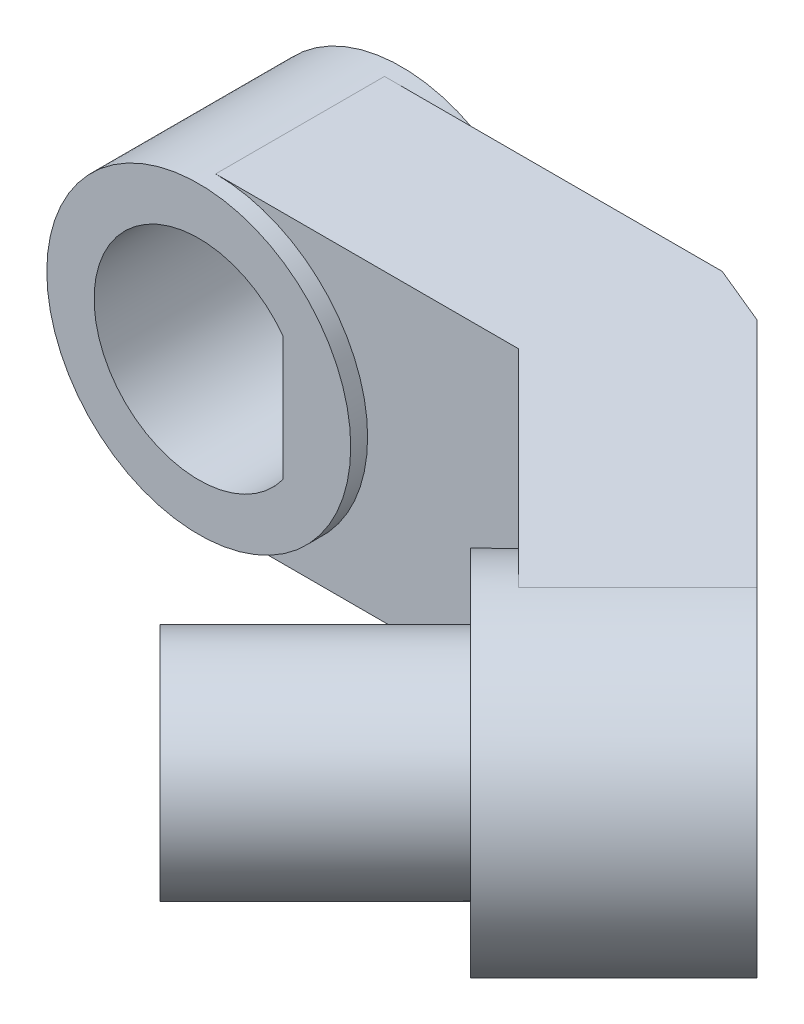
ISO-10303-21;
HEADER;
FILE_DESCRIPTION(('STEP AP214'),'2;1');
FILE_NAME('part.step','',(''),(''),'','','');
FILE_SCHEMA(('AUTOMOTIVE_DESIGN { 1 0 10303 214 1 1 1 1 }'));
ENDSEC;
DATA;
#1=APPLICATION_CONTEXT('core data for automotive mechanical design processes');
#2=APPLICATION_PROTOCOL_DEFINITION('international standard','automotive_design',2000,#1);
#3=PRODUCT_CONTEXT('',#1,'mechanical');
#4=PRODUCT('Part','Part','',(#3));
#5=PRODUCT_RELATED_PRODUCT_CATEGORY('part','',(#4));
#6=PRODUCT_DEFINITION_FORMATION('','',#4);
#7=PRODUCT_DEFINITION_CONTEXT('part definition',#1,'design');
#8=PRODUCT_DEFINITION('design','',#6,#7);
#9=PRODUCT_DEFINITION_SHAPE('','',#8);
#10=(LENGTH_UNIT() NAMED_UNIT(*) SI_UNIT(.MILLI.,.METRE.));
#11=(NAMED_UNIT(*) PLANE_ANGLE_UNIT() SI_UNIT($,.RADIAN.));
#12=(NAMED_UNIT(*) SI_UNIT($,.STERADIAN.) SOLID_ANGLE_UNIT());
#13=UNCERTAINTY_MEASURE_WITH_UNIT(LENGTH_MEASURE(1.E-05),#10,'distance_accuracy_value','');
#14=(GEOMETRIC_REPRESENTATION_CONTEXT(3) GLOBAL_UNCERTAINTY_ASSIGNED_CONTEXT((#13)) GLOBAL_UNIT_ASSIGNED_CONTEXT((#10,
#11,#12)) REPRESENTATION_CONTEXT('',''));
#15=CARTESIAN_POINT('',(0.,0.,0.));
#16=DIRECTION('',(0.,0.,1.));
#17=DIRECTION('',(1.,0.,0.));
#18=AXIS2_PLACEMENT_3D('',#15,#16,#17);
#19=CARTESIAN_POINT('',(0.,0.,2.5));
#20=DIRECTION('',(0.,0.,1.));
#21=DIRECTION('',(1.,0.,0.));
#22=AXIS2_PLACEMENT_3D('',#19,#20,#21);
#23=PLANE('',#22);
#24=DIRECTION('',(1.,0.,0.));
#25=VECTOR('',#24,1.);
#26=CARTESIAN_POINT('',(-1.11022302462516E-13,-4.49999999999995,2.49999999999989));
#27=LINE('',#26,#25);
#28=CARTESIAN_POINT('',(0.,-4.49999999999997,2.50000000000089));
#29=VERTEX_POINT('',#28);
#30=CARTESIAN_POINT('',(8.96446609406728,-4.5,2.5));
#31=VERTEX_POINT('',#30);
#32=EDGE_CURVE('E136',#29,#31,#27,.T.);
#33=ORIENTED_EDGE('',*,*,#32,.T.);
#34=DIRECTION('',(0.,1.,0.));
#35=VECTOR('',#34,1.);
#36=CARTESIAN_POINT('',(8.96446609406727,0.,2.5));
#37=LINE('',#36,#35);
#38=CARTESIAN_POINT('',(8.9644660940673,4.50000000000011,2.50000000000015));
#39=VERTEX_POINT('',#38);
#40=EDGE_CURVE('E63',#31,#39,#37,.T.);
#41=ORIENTED_EDGE('',*,*,#40,.T.);
#42=DIRECTION('',(1.,0.,0.));
#43=VECTOR('',#42,1.);
#44=CARTESIAN_POINT('',(0.,4.50000000000012,2.50000000000011));
#45=LINE('',#44,#43);
#46=CARTESIAN_POINT('',(0.,4.50000000000006,2.50000000000011));
#47=VERTEX_POINT('',#46);
#48=EDGE_CURVE('E144',#47,#39,#45,.T.);
#49=ORIENTED_EDGE('',*,*,#48,.F.);
#50=CARTESIAN_POINT('',(0.,0.,2.5));
#51=DIRECTION('',(0.,0.,1.));
#52=DIRECTION('',(1.,0.,0.));
#53=AXIS2_PLACEMENT_3D('',#50,#51,#52);
#54=CIRCLE('',#53,4.5);
#55=EDGE_CURVE('E124',#29,#47,#54,.T.);
#56=ORIENTED_EDGE('',*,*,#55,.F.);
#57=EDGE_LOOP('',(#33,#41,#49,#56));
#58=FACE_BOUND('',#57,.T.);
#59=ADVANCED_FACE('F53',(#58),#23,.T.);
#60=CARTESIAN_POINT('',(0.,0.,3.));
#61=DIRECTION('',(0.,0.,1.));
#62=DIRECTION('',(1.,0.,0.));
#63=AXIS2_PLACEMENT_3D('',#60,#61,#62);
#64=PLANE('',#63);
#65=CARTESIAN_POINT('',(0.,0.,3.));
#66=DIRECTION('',(0.,0.,1.));
#67=DIRECTION('',(1.,0.,0.));
#68=AXIS2_PLACEMENT_3D('',#65,#66,#67);
#69=CIRCLE('',#68,4.5);
#70=CARTESIAN_POINT('',(4.5,0.,3.));
#71=VERTEX_POINT('',#70);
#72=EDGE_CURVE('E185',#71,#71,#69,.T.);
#73=ORIENTED_EDGE('',*,*,#72,.T.);
#74=EDGE_LOOP('',(#73));
#75=FACE_BOUND('',#74,.T.);
#76=DIRECTION('',(0.,1.,0.));
#77=VECTOR('',#76,1.);
#78=CARTESIAN_POINT('',(2.5,-1.83303027798234,3.));
#79=LINE('',#78,#77);
#80=CARTESIAN_POINT('',(2.5,-1.83303027798234,3.));
#81=VERTEX_POINT('',#80);
#82=CARTESIAN_POINT('',(2.5,1.83303027798234,3.));
#83=VERTEX_POINT('',#82);
#84=EDGE_CURVE('E166',#81,#83,#79,.T.);
#85=ORIENTED_EDGE('',*,*,#84,.F.);
#86=CARTESIAN_POINT('',(0.,0.,3.));
#87=DIRECTION('',(0.,0.,1.));
#88=DIRECTION('',(1.,0.,0.));
#89=AXIS2_PLACEMENT_3D('',#86,#87,#88);
#90=CIRCLE('',#89,3.1);
#91=EDGE_CURVE('E162',#83,#81,#90,.T.);
#92=ORIENTED_EDGE('',*,*,#91,.F.);
#93=EDGE_LOOP('',(#85,#92));
#94=FACE_BOUND('',#93,.T.);
#95=ADVANCED_FACE('F275',(#75,#94),#64,.T.);
#96=CARTESIAN_POINT('',(0.,0.,-3.));
#97=DIRECTION('',(0.,0.,1.));
#98=DIRECTION('',(1.,0.,0.));
#99=AXIS2_PLACEMENT_3D('',#96,#97,#98);
#100=PLANE('',#99);
#101=CARTESIAN_POINT('',(0.,0.,-3.));
#102=DIRECTION('',(0.,0.,1.));
#103=DIRECTION('',(1.,0.,0.));
#104=AXIS2_PLACEMENT_3D('',#101,#102,#103);
#105=CIRCLE('',#104,4.5);
#106=CARTESIAN_POINT('',(4.5,0.,-3.));
#107=VERTEX_POINT('',#106);
#108=EDGE_CURVE('E184',#107,#107,#105,.T.);
#109=ORIENTED_EDGE('',*,*,#108,.F.);
#110=EDGE_LOOP('',(#109));
#111=FACE_BOUND('',#110,.T.);
#112=CARTESIAN_POINT('',(0.,0.,-3.));
#113=DIRECTION('',(0.,0.,1.));
#114=DIRECTION('',(1.,0.,0.));
#115=AXIS2_PLACEMENT_3D('',#112,#113,#114);
#116=CIRCLE('',#115,3.1);
#117=CARTESIAN_POINT('',(2.5,1.83303027798234,-3.));
#118=VERTEX_POINT('',#117);
#119=CARTESIAN_POINT('',(2.5,-1.83303027798234,-3.));
#120=VERTEX_POINT('',#119);
#121=EDGE_CURVE('E161',#118,#120,#116,.T.);
#122=ORIENTED_EDGE('',*,*,#121,.T.);
#123=DIRECTION('',(0.,1.,0.));
#124=VECTOR('',#123,1.);
#125=CARTESIAN_POINT('',(2.5,-1.83303027798234,-3.));
#126=LINE('',#125,#124);
#127=EDGE_CURVE('E167',#120,#118,#126,.T.);
#128=ORIENTED_EDGE('',*,*,#127,.T.);
#129=EDGE_LOOP('',(#122,#128));
#130=FACE_BOUND('',#129,.T.);
#131=ADVANCED_FACE('F281',(#111,#130),#100,.F.);
#132=CARTESIAN_POINT('',(0.,0.,3.));
#133=DIRECTION('',(0.,0.,-1.));
#134=DIRECTION('',(-1.,0.,0.));
#135=AXIS2_PLACEMENT_3D('',#132,#133,#134);
#136=CYLINDRICAL_SURFACE('',#135,4.5);
#137=DIRECTION('',(0.,0.,-1.));
#138=VECTOR('',#137,1.);
#139=CARTESIAN_POINT('',(-1.11022302462516E-13,-4.49999999999995,2.49999999999989));
#140=LINE('',#139,#138);
#141=CARTESIAN_POINT('',(0.,-4.5,-2.50000000000001));
#142=VERTEX_POINT('',#141);
#143=EDGE_CURVE('E130',#29,#142,#140,.T.);
#144=ORIENTED_EDGE('',*,*,#143,.F.);
#145=ORIENTED_EDGE('',*,*,#55,.T.);
#146=DIRECTION('',(0.,0.,-1.));
#147=VECTOR('',#146,1.);
#148=CARTESIAN_POINT('',(0.,4.50000000000012,2.50000000000011));
#149=LINE('',#148,#147);
#150=CARTESIAN_POINT('',(0.,4.50000000000012,-2.49999999999989));
#151=VERTEX_POINT('',#150);
#152=EDGE_CURVE('E127',#47,#151,#149,.T.);
#153=ORIENTED_EDGE('',*,*,#152,.T.);
#154=CARTESIAN_POINT('',(0.,0.,-2.5));
#155=DIRECTION('',(0.,0.,1.));
#156=DIRECTION('',(1.,0.,0.));
#157=AXIS2_PLACEMENT_3D('',#154,#155,#156);
#158=CIRCLE('',#157,4.5);
#159=EDGE_CURVE('E154',#142,#151,#158,.T.);
#160=ORIENTED_EDGE('',*,*,#159,.F.);
#161=EDGE_LOOP('',(#144,#145,#153,#160));
#162=FACE_BOUND('',#161,.T.);
#163=ORIENTED_EDGE('',*,*,#72,.F.);
#164=EDGE_LOOP('',(#163));
#165=FACE_BOUND('',#164,.T.);
#166=ORIENTED_EDGE('',*,*,#108,.T.);
#167=EDGE_LOOP('',(#166));
#168=FACE_BOUND('',#167,.T.);
#169=ADVANCED_FACE('F55',(#162,#165,#168),#136,.T.);
#170=CARTESIAN_POINT('',(0.,0.,3.));
#171=DIRECTION('',(0.,0.,-1.));
#172=DIRECTION('',(-1.,0.,0.));
#173=AXIS2_PLACEMENT_3D('',#170,#171,#172);
#174=CYLINDRICAL_SURFACE('',#173,3.1);
#175=ORIENTED_EDGE('',*,*,#121,.F.);
#176=DIRECTION('',(0.,0.,-1.));
#177=VECTOR('',#176,1.);
#178=CARTESIAN_POINT('',(2.5,1.83303027798234,3.));
#179=LINE('',#178,#177);
#180=EDGE_CURVE('E170',#83,#118,#179,.T.);
#181=ORIENTED_EDGE('',*,*,#180,.F.);
#182=ORIENTED_EDGE('',*,*,#91,.T.);
#183=DIRECTION('',(0.,0.,-1.));
#184=VECTOR('',#183,1.);
#185=CARTESIAN_POINT('',(2.5,-1.83303027798234,3.));
#186=LINE('',#185,#184);
#187=EDGE_CURVE('E180',#81,#120,#186,.T.);
#188=ORIENTED_EDGE('',*,*,#187,.T.);
#189=EDGE_LOOP('',(#175,#181,#182,#188));
#190=FACE_BOUND('',#189,.T.);
#191=ADVANCED_FACE('F290',(#190),#174,.F.);
#192=CARTESIAN_POINT('',(2.5,-1.83303027798234,3.));
#193=DIRECTION('',(-1.,0.,0.));
#194=DIRECTION('',(0.,0.,1.));
#195=AXIS2_PLACEMENT_3D('',#192,#193,#194);
#196=PLANE('',#195);
#197=ORIENTED_EDGE('',*,*,#127,.F.);
#198=ORIENTED_EDGE('',*,*,#187,.F.);
#199=ORIENTED_EDGE('',*,*,#84,.T.);
#200=ORIENTED_EDGE('',*,*,#180,.T.);
#201=EDGE_LOOP('',(#197,#198,#199,#200));
#202=FACE_BOUND('',#201,.T.);
#203=ADVANCED_FACE('F287',(#202),#196,.T.);
#204=CARTESIAN_POINT('',(-1.11022302462516E-13,-4.49999999999995,2.49999999999989));
#205=DIRECTION('',(0.,1.,0.));
#206=DIRECTION('',(-1.,0.,0.));
#207=AXIS2_PLACEMENT_3D('',#204,#205,#206);
#208=PLANE('',#207);
#209=DIRECTION('',(1.,0.,0.));
#210=VECTOR('',#209,1.);
#211=CARTESIAN_POINT('',(-1.11022302462516E-13,-4.49999999999995,-2.50000000000011));
#212=LINE('',#211,#210);
#213=CARTESIAN_POINT('',(9.99999999999681,-4.49999999999998,-2.5));
#214=VERTEX_POINT('',#213);
#215=EDGE_CURVE('E156',#142,#214,#212,.T.);
#216=ORIENTED_EDGE('',*,*,#215,.T.);
#217=DIRECTION('',(-0.923879532511773,0.,-0.382683432363916));
#218=VECTOR('',#217,1.);
#219=CARTESIAN_POINT('',(11.7677669529664,-4.5,-1.76776695296638));
#220=LINE('',#219,#218);
#221=CARTESIAN_POINT('',(11.7677669529664,-4.5,-1.76776695296638));
#222=VERTEX_POINT('',#221);
#223=EDGE_CURVE('E90',#222,#214,#220,.T.);
#224=ORIENTED_EDGE('',*,*,#223,.F.);
#225=DIRECTION('',(0.707106781186551,0.,0.707106781186544));
#226=VECTOR('',#225,1.);
#227=CARTESIAN_POINT('',(6.76776695296631,-4.5,-6.76776695296638));
#228=LINE('',#227,#226);
#229=CARTESIAN_POINT('',(18.6267027304759,-4.5,5.09116882454309));
#230=VERTEX_POINT('',#229);
#231=EDGE_CURVE('E203',#222,#230,#228,.T.);
#232=ORIENTED_EDGE('',*,*,#231,.T.);
#233=DIRECTION('',(-0.707106781186544,0.,0.707106781186551));
#234=VECTOR('',#233,1.);
#235=CARTESIAN_POINT('',(18.6267027304759,-4.5,5.09116882454309));
#236=LINE('',#235,#234);
#237=CARTESIAN_POINT('',(15.0911688245432,-4.5,8.62670273047585));
#238=VERTEX_POINT('',#237);
#239=EDGE_CURVE('E212',#230,#238,#236,.T.);
#240=ORIENTED_EDGE('',*,*,#239,.T.);
#241=DIRECTION('',(0.707106781186551,0.,0.707106781186544));
#242=VECTOR('',#241,1.);
#243=CARTESIAN_POINT('',(3.23223304703359,-4.5,-3.23223304703363));
#244=LINE('',#243,#242);
#245=EDGE_CURVE('E202',#31,#238,#244,.T.);
#246=ORIENTED_EDGE('',*,*,#245,.F.);
#247=ORIENTED_EDGE('',*,*,#32,.F.);
#248=ORIENTED_EDGE('',*,*,#143,.T.);
#249=EDGE_LOOP('',(#216,#224,#232,#240,#246,#247,#248));
#250=FACE_BOUND('',#249,.T.);
#251=ADVANCED_FACE('F221',(#250),#208,.F.);
#252=CARTESIAN_POINT('',(0.,4.50000000000012,2.50000000000011));
#253=DIRECTION('',(0.,1.,0.));
#254=DIRECTION('',(-1.,0.,0.));
#255=AXIS2_PLACEMENT_3D('',#252,#253,#254);
#256=PLANE('',#255);
#257=DIRECTION('',(0.707106781186551,0.,0.707106781186544));
#258=VECTOR('',#257,1.);
#259=CARTESIAN_POINT('',(6.76776695296631,4.5,-6.76776695296638));
#260=LINE('',#259,#258);
#261=CARTESIAN_POINT('',(11.7677669529664,4.5,-1.76776695296638));
#262=VERTEX_POINT('',#261);
#263=CARTESIAN_POINT('',(18.6267027304759,4.5,5.09116882454309));
#264=VERTEX_POINT('',#263);
#265=EDGE_CURVE('E197',#262,#264,#260,.T.);
#266=ORIENTED_EDGE('',*,*,#265,.F.);
#267=DIRECTION('',(-0.923879532511761,0.,-0.382683432363945));
#268=VECTOR('',#267,1.);
#269=CARTESIAN_POINT('',(10.8838834764822,4.5,-2.1338834764823));
#270=LINE('',#269,#268);
#271=CARTESIAN_POINT('',(9.99999999999717,4.50000000000008,-2.49999999999984));
#272=VERTEX_POINT('',#271);
#273=EDGE_CURVE('E216',#262,#272,#270,.T.);
#274=ORIENTED_EDGE('',*,*,#273,.T.);
#275=DIRECTION('',(1.,0.,0.));
#276=VECTOR('',#275,1.);
#277=CARTESIAN_POINT('',(0.,4.50000000000012,-2.49999999999989));
#278=LINE('',#277,#276);
#279=EDGE_CURVE('E137',#151,#272,#278,.T.);
#280=ORIENTED_EDGE('',*,*,#279,.F.);
#281=ORIENTED_EDGE('',*,*,#152,.F.);
#282=ORIENTED_EDGE('',*,*,#48,.T.);
#283=DIRECTION('',(0.707106781186551,0.,0.707106781186544));
#284=VECTOR('',#283,1.);
#285=CARTESIAN_POINT('',(3.23223304703359,4.5,-3.23223304703363));
#286=LINE('',#285,#284);
#287=CARTESIAN_POINT('',(15.0911688245432,4.5,8.62670273047585));
#288=VERTEX_POINT('',#287);
#289=EDGE_CURVE('E71',#39,#288,#286,.T.);
#290=ORIENTED_EDGE('',*,*,#289,.T.);
#291=DIRECTION('',(-0.707106781186544,0.,0.707106781186551));
#292=VECTOR('',#291,1.);
#293=CARTESIAN_POINT('',(18.6267027304759,4.5,5.09116882454309));
#294=LINE('',#293,#292);
#295=EDGE_CURVE('E157',#264,#288,#294,.T.);
#296=ORIENTED_EDGE('',*,*,#295,.F.);
#297=EDGE_LOOP('',(#266,#274,#280,#281,#282,#290,#296));
#298=FACE_BOUND('',#297,.T.);
#299=ADVANCED_FACE('F143',(#298),#256,.T.);
#300=CARTESIAN_POINT('',(0.,0.,-2.5));
#301=DIRECTION('',(0.,0.,1.));
#302=DIRECTION('',(1.,0.,0.));
#303=AXIS2_PLACEMENT_3D('',#300,#301,#302);
#304=PLANE('',#303);
#305=ORIENTED_EDGE('',*,*,#159,.T.);
#306=ORIENTED_EDGE('',*,*,#279,.T.);
#307=DIRECTION('',(0.,1.,0.));
#308=VECTOR('',#307,1.);
#309=CARTESIAN_POINT('',(9.99999999999992,0.,-2.49999999999988));
#310=LINE('',#309,#308);
#311=EDGE_CURVE('E196',#214,#272,#310,.T.);
#312=ORIENTED_EDGE('',*,*,#311,.F.);
#313=ORIENTED_EDGE('',*,*,#215,.F.);
#314=EDGE_LOOP('',(#305,#306,#312,#313));
#315=FACE_BOUND('',#314,.T.);
#316=ADVANCED_FACE('F219',(#315),#304,.F.);
#317=CARTESIAN_POINT('',(18.6267027304759,0.,5.09116882454309));
#318=DIRECTION('',(-0.707106781186544,0.,0.707106781186551));
#319=DIRECTION('',(0.707106781186551,0.,0.707106781186544));
#320=AXIS2_PLACEMENT_3D('',#317,#318,#319);
#321=CYLINDRICAL_SURFACE('',#320,4.5);
#322=ORIENTED_EDGE('',*,*,#295,.T.);
#323=CARTESIAN_POINT('',(15.0911688245432,0.,8.62670273047585));
#324=DIRECTION('',(-0.707106781186544,0.,0.707106781186551));
#325=DIRECTION('',(0.707106781186551,0.,0.707106781186544));
#326=AXIS2_PLACEMENT_3D('',#323,#324,#325);
#327=CIRCLE('',#326,4.5);
#328=EDGE_CURVE('E96',#288,#238,#327,.T.);
#329=ORIENTED_EDGE('',*,*,#328,.T.);
#330=ORIENTED_EDGE('',*,*,#239,.F.);
#331=CARTESIAN_POINT('',(18.6267027304759,0.,5.09116882454309));
#332=DIRECTION('',(0.707106781186544,0.,-0.707106781186551));
#333=DIRECTION('',(-0.707106781186551,0.,-0.707106781186544));
#334=AXIS2_PLACEMENT_3D('',#331,#332,#333);
#335=CIRCLE('',#334,4.5);
#336=EDGE_CURVE('E201',#264,#230,#335,.T.);
#337=ORIENTED_EDGE('',*,*,#336,.F.);
#338=EDGE_LOOP('',(#322,#329,#330,#337));
#339=FACE_BOUND('',#338,.T.);
#340=CARTESIAN_POINT('',(14.3840620433566,0.,9.3338095116624));
#341=DIRECTION('',(-0.707106781186544,0.,0.707106781186551));
#342=DIRECTION('',(0.707106781186551,0.,0.707106781186544));
#343=AXIS2_PLACEMENT_3D('',#340,#341,#342);
#344=CIRCLE('',#343,4.5);
#345=CARTESIAN_POINT('',(17.5660425586961,0.,12.5157900270018));
#346=VERTEX_POINT('',#345);
#347=EDGE_CURVE('E253',#346,#346,#344,.T.);
#348=ORIENTED_EDGE('',*,*,#347,.F.);
#349=EDGE_LOOP('',(#348));
#350=FACE_BOUND('',#349,.T.);
#351=ADVANCED_FACE('F237',(#339,#350),#321,.T.);
#352=CARTESIAN_POINT('',(6.76776695296631,0.,-6.76776695296638));
#353=DIRECTION('',(0.707106781186544,0.,-0.707106781186551));
#354=DIRECTION('',(-0.707106781186551,0.,-0.707106781186544));
#355=AXIS2_PLACEMENT_3D('',#352,#353,#354);
#356=PLANE('',#355);
#357=ORIENTED_EDGE('',*,*,#265,.T.);
#358=ORIENTED_EDGE('',*,*,#336,.T.);
#359=ORIENTED_EDGE('',*,*,#231,.F.);
#360=DIRECTION('',(0.,1.,0.));
#361=VECTOR('',#360,1.);
#362=CARTESIAN_POINT('',(11.7677669529664,0.,-1.76776695296638));
#363=LINE('',#362,#361);
#364=EDGE_CURVE('E207',#222,#262,#363,.T.);
#365=ORIENTED_EDGE('',*,*,#364,.T.);
#366=EDGE_LOOP('',(#357,#358,#359,#365));
#367=FACE_BOUND('',#366,.T.);
#368=ADVANCED_FACE('F241',(#367),#356,.T.);
#369=CARTESIAN_POINT('',(3.23223304703359,0.,-3.23223304703363));
#370=DIRECTION('',(0.707106781186544,0.,-0.707106781186551));
#371=DIRECTION('',(-0.707106781186551,0.,-0.707106781186544));
#372=AXIS2_PLACEMENT_3D('',#369,#370,#371);
#373=PLANE('',#372);
#374=ORIENTED_EDGE('',*,*,#328,.F.);
#375=ORIENTED_EDGE('',*,*,#289,.F.);
#376=ORIENTED_EDGE('',*,*,#40,.F.);
#377=ORIENTED_EDGE('',*,*,#245,.T.);
#378=EDGE_LOOP('',(#374,#375,#376,#377));
#379=FACE_BOUND('',#378,.T.);
#380=ADVANCED_FACE('F268',(#379),#373,.F.);
#381=CARTESIAN_POINT('',(2.34834957053917,0.,-5.66941738240906));
#382=DIRECTION('',(0.382683432363916,0.,-0.923879532511773));
#383=DIRECTION('',(-0.923879532511773,0.,-0.382683432363916));
#384=AXIS2_PLACEMENT_3D('',#381,#382,#383);
#385=PLANE('',#384);
#386=ORIENTED_EDGE('',*,*,#223,.T.);
#387=ORIENTED_EDGE('',*,*,#311,.T.);
#388=ORIENTED_EDGE('',*,*,#273,.F.);
#389=ORIENTED_EDGE('',*,*,#364,.F.);
#390=EDGE_LOOP('',(#386,#387,#388,#389));
#391=FACE_BOUND('',#390,.T.);
#392=ADVANCED_FACE('F215',(#391),#385,.T.);
#393=CARTESIAN_POINT('',(14.3840620433566,0.,9.3338095116624));
#394=DIRECTION('',(-0.707106781186544,0.,0.707106781186551));
#395=DIRECTION('',(0.707106781186551,0.,0.707106781186544));
#396=AXIS2_PLACEMENT_3D('',#393,#394,#395);
#397=PLANE('',#396);
#398=CARTESIAN_POINT('',(14.3840620433566,0.,9.3338095116624));
#399=DIRECTION('',(-0.707106781186544,0.,0.707106781186551));
#400=DIRECTION('',(0.707106781186551,0.,0.707106781186544));
#401=AXIS2_PLACEMENT_3D('',#398,#399,#400);
#402=CIRCLE('',#401,2.9);
#403=CARTESIAN_POINT('',(16.4346717087976,0.,11.3844191771034));
#404=VERTEX_POINT('',#403);
#405=EDGE_CURVE('E12',#404,#404,#402,.F.);
#406=ORIENTED_EDGE('',*,*,#405,.T.);
#407=EDGE_LOOP('',(#406));
#408=FACE_BOUND('',#407,.T.);
#409=ORIENTED_EDGE('',*,*,#347,.T.);
#410=EDGE_LOOP('',(#409));
#411=FACE_BOUND('',#410,.T.);
#412=ADVANCED_FACE('F260',(#408,#411),#397,.T.);
#413=CARTESIAN_POINT('',(9.78786796564411,0.,13.930003589375));
#414=DIRECTION('',(0.707106781186544,0.,-0.707106781186551));
#415=DIRECTION('',(-0.707106781186551,0.,-0.707106781186544));
#416=AXIS2_PLACEMENT_3D('',#413,#414,#415);
#417=PLANE('',#416);
#418=CARTESIAN_POINT('',(9.78786796564411,0.,13.930003589375));
#419=DIRECTION('',(0.707106781186544,0.,-0.707106781186551));
#420=DIRECTION('',(-0.707106781186551,0.,-0.707106781186544));
#421=AXIS2_PLACEMENT_3D('',#418,#419,#420);
#422=CIRCLE('',#421,2.9);
#423=CARTESIAN_POINT('',(7.73725830020311,0.,11.879393923934));
#424=VERTEX_POINT('',#423);
#425=EDGE_CURVE('E246',#424,#424,#422,.T.);
#426=ORIENTED_EDGE('',*,*,#425,.F.);
#427=EDGE_LOOP('',(#426));
#428=FACE_BOUND('',#427,.T.);
#429=ADVANCED_FACE('F375',(#428),#417,.F.);
#430=CARTESIAN_POINT('',(9.78786796564411,0.,13.930003589375));
#431=DIRECTION('',(0.707106781186544,0.,-0.707106781186551));
#432=DIRECTION('',(-0.707106781186551,0.,-0.707106781186544));
#433=AXIS2_PLACEMENT_3D('',#430,#431,#432);
#434=CYLINDRICAL_SURFACE('',#433,2.9);
#435=ORIENTED_EDGE('',*,*,#405,.F.);
#436=EDGE_LOOP('',(#435));
#437=FACE_BOUND('',#436,.T.);
#438=ORIENTED_EDGE('',*,*,#425,.T.);
#439=EDGE_LOOP('',(#438));
#440=FACE_BOUND('',#439,.T.);
#441=ADVANCED_FACE('F371',(#437,#440),#434,.T.);
#442=CLOSED_SHELL('',(#59,#95,#131,#169,#191,#203,#251,#299,#316,#351,#368,#380,#392,#412,#429,#441));
#443=MANIFOLD_SOLID_BREP('B2',#442);
#444=ADVANCED_BREP_SHAPE_REPRESENTATION('',(#18,#443),#14);
#445=SHAPE_DEFINITION_REPRESENTATION(#9,#444);
ENDSEC;
END-ISO-10303-21;
